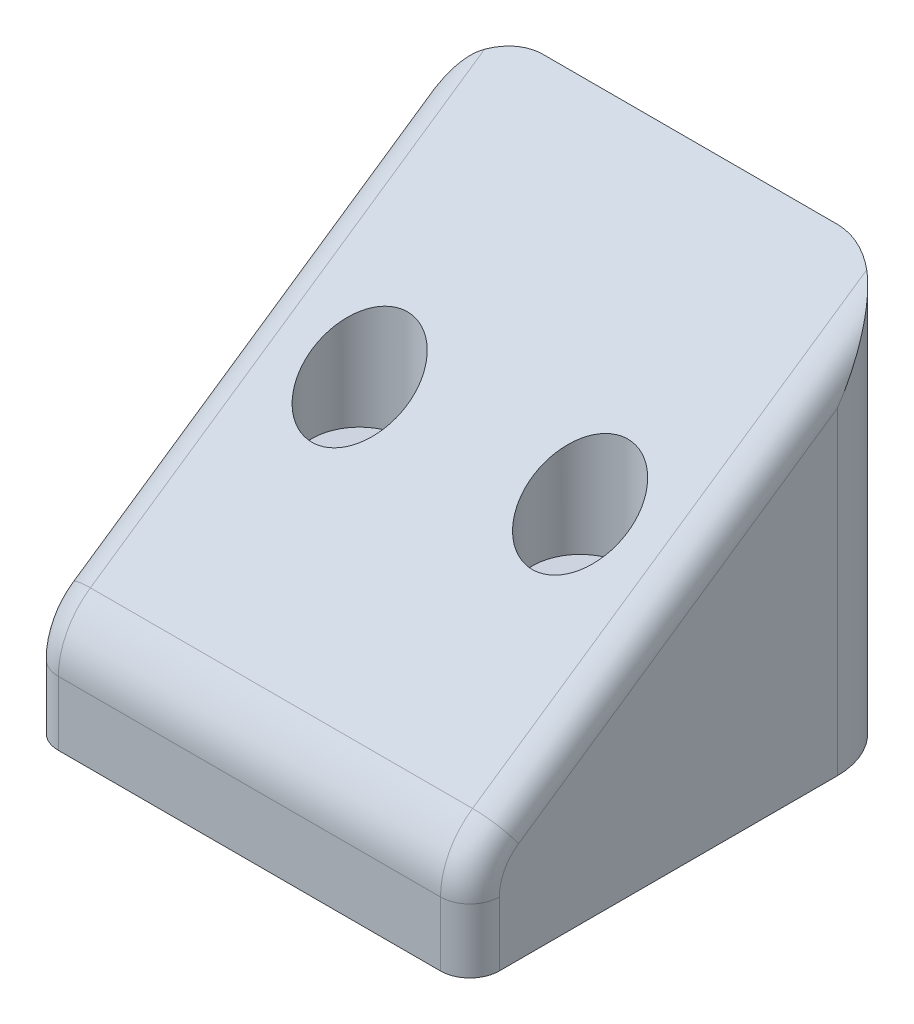
ISO-10303-21;
HEADER;
FILE_DESCRIPTION(('STEP AP214'),'2;1');
FILE_NAME('part.step','',(''),(''),'','','');
FILE_SCHEMA(('AUTOMOTIVE_DESIGN { 1 0 10303 214 1 1 1 1 }'));
ENDSEC;
DATA;
#1=APPLICATION_CONTEXT('core data for automotive mechanical design processes');
#2=APPLICATION_PROTOCOL_DEFINITION('international standard','automotive_design',2000,#1);
#3=PRODUCT_CONTEXT('',#1,'mechanical');
#4=PRODUCT('Part','Part','',(#3));
#5=PRODUCT_RELATED_PRODUCT_CATEGORY('part','',(#4));
#6=PRODUCT_DEFINITION_FORMATION('','',#4);
#7=PRODUCT_DEFINITION_CONTEXT('part definition',#1,'design');
#8=PRODUCT_DEFINITION('design','',#6,#7);
#9=PRODUCT_DEFINITION_SHAPE('','',#8);
#10=(LENGTH_UNIT() NAMED_UNIT(*) SI_UNIT(.MILLI.,.METRE.));
#11=(NAMED_UNIT(*) PLANE_ANGLE_UNIT() SI_UNIT($,.RADIAN.));
#12=(NAMED_UNIT(*) SI_UNIT($,.STERADIAN.) SOLID_ANGLE_UNIT());
#13=UNCERTAINTY_MEASURE_WITH_UNIT(LENGTH_MEASURE(1.E-05),#10,'distance_accuracy_value','');
#14=(GEOMETRIC_REPRESENTATION_CONTEXT(3) GLOBAL_UNCERTAINTY_ASSIGNED_CONTEXT((#13)) GLOBAL_UNIT_ASSIGNED_CONTEXT((#10,
#11,#12)) REPRESENTATION_CONTEXT('',''));
#15=CARTESIAN_POINT('',(0.,0.,0.));
#16=DIRECTION('',(0.,0.,1.));
#17=DIRECTION('',(1.,0.,0.));
#18=AXIS2_PLACEMENT_3D('',#15,#16,#17);
#19=CARTESIAN_POINT('',(-15.,-13.75,30.));
#20=DIRECTION('',(1.,0.,0.));
#21=DIRECTION('',(0.,0.,-1.));
#22=AXIS2_PLACEMENT_3D('',#19,#20,#21);
#23=PLANE('',#22);
#24=DIRECTION('',(0.,0.,-1.));
#25=VECTOR('',#24,1.);
#26=CARTESIAN_POINT('',(-15.,-13.75,30.));
#27=LINE('',#26,#25);
#28=CARTESIAN_POINT('',(-15.,-13.75,28.));
#29=VERTEX_POINT('',#28);
#30=CARTESIAN_POINT('',(-15.,-13.75,5.));
#31=VERTEX_POINT('',#30);
#32=EDGE_CURVE('E267',#29,#31,#27,.T.);
#33=ORIENTED_EDGE('',*,*,#32,.F.);
#34=DIRECTION('',(0.,-1.,0.));
#35=VECTOR('',#34,1.);
#36=CARTESIAN_POINT('',(-15.,-13.75,28.));
#37=LINE('',#36,#35);
#38=CARTESIAN_POINT('',(-15.,-9.38920743300805,28.));
#39=VERTEX_POINT('',#38);
#40=EDGE_CURVE('E175',#29,#39,#37,.F.);
#41=ORIENTED_EDGE('',*,*,#40,.T.);
#42=CARTESIAN_POINT('',(-15.,-9.38920743300805,25.));
#43=DIRECTION('',(1.,0.,0.));
#44=DIRECTION('',(0.,0.,-1.));
#45=AXIS2_PLACEMENT_3D('',#42,#43,#44);
#46=CIRCLE('',#45,3.);
#47=CARTESIAN_POINT('',(-15.,-6.9122735085056,26.6925715150767));
#48=VERTEX_POINT('',#47);
#49=EDGE_CURVE('E173',#39,#48,#46,.F.);
#50=ORIENTED_EDGE('',*,*,#49,.T.);
#51=DIRECTION('',(0.,0.564190505025556,-0.825644641500814));
#52=VECTOR('',#51,1.);
#53=CARTESIAN_POINT('',(-15.,-10.6294657647286,32.1323650607688));
#54=LINE('',#53,#52);
#55=CARTESIAN_POINT('',(-15.,7.91098369346344,5.));
#56=VERTEX_POINT('',#55);
#57=EDGE_CURVE('E171',#48,#56,#54,.T.);
#58=ORIENTED_EDGE('',*,*,#57,.T.);
#59=DIRECTION('',(0.,-1.,0.));
#60=VECTOR('',#59,1.);
#61=CARTESIAN_POINT('',(-15.,-13.75,5.));
#62=LINE('',#61,#60);
#63=EDGE_CURVE('E152',#56,#31,#62,.T.);
#64=ORIENTED_EDGE('',*,*,#63,.T.);
#65=EDGE_LOOP('',(#33,#41,#50,#58,#64));
#66=FACE_BOUND('',#65,.T.);
#67=ADVANCED_FACE('F38',(#66),#23,.F.);
#68=CARTESIAN_POINT('',(-15.,-13.75,30.));
#69=DIRECTION('',(0.,1.,0.));
#70=DIRECTION('',(0.,0.,1.));
#71=AXIS2_PLACEMENT_3D('',#68,#69,#70);
#72=PLANE('',#71);
#73=CARTESIAN_POINT('',(-7.5,-13.75,15.));
#74=DIRECTION('',(0.,1.,0.));
#75=DIRECTION('',(0.,0.,1.));
#76=AXIS2_PLACEMENT_3D('',#73,#74,#75);
#77=CIRCLE('',#76,1.5);
#78=CARTESIAN_POINT('',(-7.5,-13.75,16.5));
#79=VERTEX_POINT('',#78);
#80=EDGE_CURVE('E288',#79,#79,#77,.T.);
#81=ORIENTED_EDGE('',*,*,#80,.T.);
#82=EDGE_LOOP('',(#81));
#83=FACE_BOUND('',#82,.T.);
#84=CARTESIAN_POINT('',(7.5,-13.75,15.));
#85=DIRECTION('',(0.,1.,0.));
#86=DIRECTION('',(0.,0.,-1.));
#87=AXIS2_PLACEMENT_3D('',#84,#85,#86);
#88=CIRCLE('',#87,1.5);
#89=CARTESIAN_POINT('',(7.5,-13.75,13.5));
#90=VERTEX_POINT('',#89);
#91=EDGE_CURVE('E248',#90,#90,#88,.T.);
#92=ORIENTED_EDGE('',*,*,#91,.T.);
#93=EDGE_LOOP('',(#92));
#94=FACE_BOUND('',#93,.T.);
#95=DIRECTION('',(1.,0.,0.));
#96=VECTOR('',#95,1.);
#97=CARTESIAN_POINT('',(-15.,-13.75,30.));
#98=LINE('',#97,#96);
#99=CARTESIAN_POINT('',(-13.,-13.75,30.));
#100=VERTEX_POINT('',#99);
#101=CARTESIAN_POINT('',(13.,-13.75,30.));
#102=VERTEX_POINT('',#101);
#103=EDGE_CURVE('E141',#100,#102,#98,.T.);
#104=ORIENTED_EDGE('',*,*,#103,.F.);
#105=CARTESIAN_POINT('',(-13.,-13.75,28.));
#106=DIRECTION('',(0.,1.,0.));
#107=DIRECTION('',(0.,0.,1.));
#108=AXIS2_PLACEMENT_3D('',#105,#106,#107);
#109=CIRCLE('',#108,2.);
#110=EDGE_CURVE('E169',#100,#29,#109,.F.);
#111=ORIENTED_EDGE('',*,*,#110,.T.);
#112=ORIENTED_EDGE('',*,*,#32,.T.);
#113=CARTESIAN_POINT('',(-10.,-13.75,5.));
#114=DIRECTION('',(0.,1.,0.));
#115=DIRECTION('',(0.,0.,1.));
#116=AXIS2_PLACEMENT_3D('',#113,#114,#115);
#117=CIRCLE('',#116,5.);
#118=CARTESIAN_POINT('',(-10.,-13.75,0.));
#119=VERTEX_POINT('',#118);
#120=EDGE_CURVE('E149',#31,#119,#117,.F.);
#121=ORIENTED_EDGE('',*,*,#120,.T.);
#122=DIRECTION('',(1.,0.,0.));
#123=VECTOR('',#122,1.);
#124=CARTESIAN_POINT('',(-15.,-13.75,0.));
#125=LINE('',#124,#123);
#126=CARTESIAN_POINT('',(10.,-13.75,0.));
#127=VERTEX_POINT('',#126);
#128=EDGE_CURVE('E142',#119,#127,#125,.T.);
#129=ORIENTED_EDGE('',*,*,#128,.T.);
#130=CARTESIAN_POINT('',(10.,-13.75,5.));
#131=DIRECTION('',(0.,1.,0.));
#132=DIRECTION('',(0.,0.,1.));
#133=AXIS2_PLACEMENT_3D('',#130,#131,#132);
#134=CIRCLE('',#133,5.);
#135=CARTESIAN_POINT('',(15.,-13.75,5.));
#136=VERTEX_POINT('',#135);
#137=EDGE_CURVE('E148',#127,#136,#134,.F.);
#138=ORIENTED_EDGE('',*,*,#137,.T.);
#139=DIRECTION('',(0.,0.,-1.));
#140=VECTOR('',#139,1.);
#141=CARTESIAN_POINT('',(15.,-13.75,30.));
#142=LINE('',#141,#140);
#143=CARTESIAN_POINT('',(15.,-13.75,28.));
#144=VERTEX_POINT('',#143);
#145=EDGE_CURVE('E265',#144,#136,#142,.T.);
#146=ORIENTED_EDGE('',*,*,#145,.F.);
#147=CARTESIAN_POINT('',(13.,-13.75,28.));
#148=DIRECTION('',(0.,1.,0.));
#149=DIRECTION('',(0.,0.,1.));
#150=AXIS2_PLACEMENT_3D('',#147,#148,#149);
#151=CIRCLE('',#150,2.);
#152=EDGE_CURVE('E167',#144,#102,#151,.F.);
#153=ORIENTED_EDGE('',*,*,#152,.T.);
#154=EDGE_LOOP('',(#104,#111,#112,#121,#129,#138,#146,#153));
#155=FACE_BOUND('',#154,.T.);
#156=ADVANCED_FACE('F213',(#83,#94,#155),#72,.F.);
#157=CARTESIAN_POINT('',(15.,-13.75,30.));
#158=DIRECTION('',(-1.,0.,0.));
#159=DIRECTION('',(0.,0.,1.));
#160=AXIS2_PLACEMENT_3D('',#157,#158,#159);
#161=PLANE('',#160);
#162=CARTESIAN_POINT('',(15.,-9.38920743300805,25.));
#163=DIRECTION('',(-1.,0.,0.));
#164=DIRECTION('',(0.,0.,1.));
#165=AXIS2_PLACEMENT_3D('',#162,#163,#164);
#166=CIRCLE('',#165,3.);
#167=CARTESIAN_POINT('',(15.,-6.9122735085056,26.6925715150767));
#168=VERTEX_POINT('',#167);
#169=CARTESIAN_POINT('',(15.,-9.38920743300805,28.));
#170=VERTEX_POINT('',#169);
#171=EDGE_CURVE('E177',#168,#170,#166,.F.);
#172=ORIENTED_EDGE('',*,*,#171,.T.);
#173=DIRECTION('',(0.,1.,0.));
#174=VECTOR('',#173,1.);
#175=CARTESIAN_POINT('',(15.,-13.75,28.));
#176=LINE('',#175,#174);
#177=EDGE_CURVE('E181',#170,#144,#176,.F.);
#178=ORIENTED_EDGE('',*,*,#177,.T.);
#179=ORIENTED_EDGE('',*,*,#145,.T.);
#180=DIRECTION('',(0.,1.,0.));
#181=VECTOR('',#180,1.);
#182=CARTESIAN_POINT('',(15.,13.75,5.));
#183=LINE('',#182,#181);
#184=CARTESIAN_POINT('',(15.,7.91098369346344,5.));
#185=VERTEX_POINT('',#184);
#186=EDGE_CURVE('E241',#136,#185,#183,.T.);
#187=ORIENTED_EDGE('',*,*,#186,.T.);
#188=DIRECTION('',(0.,0.564190505025556,-0.825644641500814));
#189=VECTOR('',#188,1.);
#190=CARTESIAN_POINT('',(15.,-10.6294657647286,32.1323650607688));
#191=LINE('',#190,#189);
#192=EDGE_CURVE('E179',#185,#168,#191,.F.);
#193=ORIENTED_EDGE('',*,*,#192,.T.);
#194=EDGE_LOOP('',(#172,#178,#179,#187,#193));
#195=FACE_BOUND('',#194,.T.);
#196=ADVANCED_FACE('F219',(#195),#161,.F.);
#197=CARTESIAN_POINT('',(0.,0.,30.));
#198=DIRECTION('',(0.,0.,-1.));
#199=DIRECTION('',(-1.,0.,0.));
#200=AXIS2_PLACEMENT_3D('',#197,#198,#199);
#201=PLANE('',#200);
#202=DIRECTION('',(1.,0.,0.));
#203=VECTOR('',#202,1.);
#204=CARTESIAN_POINT('',(0.,-9.38920743300805,30.));
#205=LINE('',#204,#203);
#206=CARTESIAN_POINT('',(13.,-9.38920743300805,30.));
#207=VERTEX_POINT('',#206);
#208=CARTESIAN_POINT('',(-13.,-9.38920743300805,30.));
#209=VERTEX_POINT('',#208);
#210=EDGE_CURVE('E260',#207,#209,#205,.F.);
#211=ORIENTED_EDGE('',*,*,#210,.T.);
#212=DIRECTION('',(0.,-1.,0.));
#213=VECTOR('',#212,1.);
#214=CARTESIAN_POINT('',(-13.,0.,30.));
#215=LINE('',#214,#213);
#216=EDGE_CURVE('E165',#209,#100,#215,.T.);
#217=ORIENTED_EDGE('',*,*,#216,.T.);
#218=ORIENTED_EDGE('',*,*,#103,.T.);
#219=DIRECTION('',(0.,1.,0.));
#220=VECTOR('',#219,1.);
#221=CARTESIAN_POINT('',(13.,0.,30.));
#222=LINE('',#221,#220);
#223=EDGE_CURVE('E162',#102,#207,#222,.T.);
#224=ORIENTED_EDGE('',*,*,#223,.T.);
#225=EDGE_LOOP('',(#211,#217,#218,#224));
#226=FACE_BOUND('',#225,.T.);
#227=ADVANCED_FACE('F258',(#226),#201,.F.);
#228=CARTESIAN_POINT('',(0.,0.,0.));
#229=DIRECTION('',(0.,0.,-1.));
#230=DIRECTION('',(-1.,0.,0.));
#231=AXIS2_PLACEMENT_3D('',#228,#229,#230);
#232=PLANE('',#231);
#233=CARTESIAN_POINT('',(4.95,-6.25,0.));
#234=DIRECTION('',(0.,0.,-1.));
#235=DIRECTION('',(-1.,0.,0.));
#236=AXIS2_PLACEMENT_3D('',#233,#234,#235);
#237=CIRCLE('',#236,1.25);
#238=CARTESIAN_POINT('',(3.7,-6.25,0.));
#239=VERTEX_POINT('',#238);
#240=EDGE_CURVE('E283',#239,#239,#237,.T.);
#241=ORIENTED_EDGE('',*,*,#240,.F.);
#242=EDGE_LOOP('',(#241));
#243=FACE_BOUND('',#242,.T.);
#244=CARTESIAN_POINT('',(-4.95,-6.25,0.));
#245=DIRECTION('',(0.,0.,-1.));
#246=DIRECTION('',(-1.,0.,0.));
#247=AXIS2_PLACEMENT_3D('',#244,#245,#246);
#248=CIRCLE('',#247,1.25);
#249=CARTESIAN_POINT('',(-6.2,-6.25,0.));
#250=VERTEX_POINT('',#249);
#251=EDGE_CURVE('E554',#250,#250,#248,.T.);
#252=ORIENTED_EDGE('',*,*,#251,.F.);
#253=EDGE_LOOP('',(#252));
#254=FACE_BOUND('',#253,.T.);
#255=CARTESIAN_POINT('',(-4.95,3.65,0.));
#256=DIRECTION('',(0.,0.,-1.));
#257=DIRECTION('',(-1.,0.,0.));
#258=AXIS2_PLACEMENT_3D('',#255,#256,#257);
#259=CIRCLE('',#258,1.25);
#260=CARTESIAN_POINT('',(-6.2,3.65,0.));
#261=VERTEX_POINT('',#260);
#262=EDGE_CURVE('E543',#261,#261,#259,.T.);
#263=ORIENTED_EDGE('',*,*,#262,.F.);
#264=EDGE_LOOP('',(#263));
#265=FACE_BOUND('',#264,.T.);
#266=CARTESIAN_POINT('',(4.95,3.65,0.));
#267=DIRECTION('',(0.,0.,-1.));
#268=DIRECTION('',(-1.,0.,0.));
#269=AXIS2_PLACEMENT_3D('',#266,#267,#268);
#270=CIRCLE('',#269,1.25);
#271=CARTESIAN_POINT('',(3.7,3.65,0.));
#272=VERTEX_POINT('',#271);
#273=EDGE_CURVE('E271',#272,#272,#270,.T.);
#274=ORIENTED_EDGE('',*,*,#273,.F.);
#275=EDGE_LOOP('',(#274));
#276=FACE_BOUND('',#275,.T.);
#277=DIRECTION('',(-1.,0.,0.));
#278=VECTOR('',#277,1.);
#279=CARTESIAN_POINT('',(-15.,13.75,0.));
#280=LINE('',#279,#278);
#281=CARTESIAN_POINT('',(10.,13.75,0.));
#282=VERTEX_POINT('',#281);
#283=CARTESIAN_POINT('',(-10.,13.75,0.));
#284=VERTEX_POINT('',#283);
#285=EDGE_CURVE('E127',#282,#284,#280,.T.);
#286=ORIENTED_EDGE('',*,*,#285,.F.);
#287=DIRECTION('',(0.,1.,0.));
#288=VECTOR('',#287,1.);
#289=CARTESIAN_POINT('',(10.,-13.75,0.));
#290=LINE('',#289,#288);
#291=EDGE_CURVE('E137',#282,#127,#290,.F.);
#292=ORIENTED_EDGE('',*,*,#291,.T.);
#293=ORIENTED_EDGE('',*,*,#128,.F.);
#294=DIRECTION('',(0.,-1.,0.));
#295=VECTOR('',#294,1.);
#296=CARTESIAN_POINT('',(-10.,13.75,0.));
#297=LINE('',#296,#295);
#298=EDGE_CURVE('E140',#119,#284,#297,.F.);
#299=ORIENTED_EDGE('',*,*,#298,.T.);
#300=EDGE_LOOP('',(#286,#292,#293,#299));
#301=FACE_BOUND('',#300,.T.);
#302=ADVANCED_FACE('F135',(#243,#254,#265,#276,#301),#232,.T.);
#303=CARTESIAN_POINT('',(-15.,13.75,0.));
#304=DIRECTION('',(0.,-0.825644641500814,-0.564190505025556));
#305=DIRECTION('',(0.,0.564190505025556,-0.825644641500814));
#306=AXIS2_PLACEMENT_3D('',#303,#304,#305);
#307=PLANE('',#306);
#308=CARTESIAN_POINT('',(-7.5,3.5,15.));
#309=DIRECTION('',(0.,-0.825644641500814,-0.564190505025556));
#310=DIRECTION('',(0.,0.564190505025556,-0.825644641500814));
#311=AXIS2_PLACEMENT_3D('',#308,#309,#310);
#312=ELLIPSE('',#311,3.93631816478857,3.25);
#313=CARTESIAN_POINT('',(-7.5,5.72083333333333,11.75));
#314=VERTEX_POINT('',#313);
#315=EDGE_CURVE('E279',#314,#314,#312,.T.);
#316=ORIENTED_EDGE('',*,*,#315,.T.);
#317=EDGE_LOOP('',(#316));
#318=FACE_BOUND('',#317,.T.);
#319=CARTESIAN_POINT('',(7.5,3.5,15.));
#320=DIRECTION('',(0.,-0.825644641500814,-0.564190505025556));
#321=DIRECTION('',(0.,0.564190505025556,-0.825644641500814));
#322=AXIS2_PLACEMENT_3D('',#319,#320,#321);
#323=ELLIPSE('',#322,3.93631816478857,3.25);
#324=CARTESIAN_POINT('',(7.5,5.72083333333333,11.75));
#325=VERTEX_POINT('',#324);
#326=EDGE_CURVE('E276',#325,#325,#323,.T.);
#327=ORIENTED_EDGE('',*,*,#326,.T.);
#328=EDGE_LOOP('',(#327));
#329=FACE_BOUND('',#328,.T.);
#330=CARTESIAN_POINT('',(-10.,10.3333333333333,5.));
#331=DIRECTION('',(0.,-0.825644641500814,-0.564190505025556));
#332=DIRECTION('',(0.,0.564190505025556,-0.825644641500814));
#333=AXIS2_PLACEMENT_3D('',#330,#331,#332);
#334=ELLIPSE('',#333,6.05587409967472,5.);
#335=CARTESIAN_POINT('',(-13.,13.0666666666667,1.));
#336=VERTEX_POINT('',#335);
#337=EDGE_CURVE('E132',#284,#336,#334,.F.);
#338=ORIENTED_EDGE('',*,*,#337,.T.);
#339=DIRECTION('',(0.,0.564190505025556,-0.825644641500814));
#340=VECTOR('',#339,1.);
#341=CARTESIAN_POINT('',(-13.,13.75,0.));
#342=LINE('',#341,#340);
#343=CARTESIAN_POINT('',(-13.,-5.26098422550397,27.8209525251278));
#344=VERTEX_POINT('',#343);
#345=EDGE_CURVE('E48',#336,#344,#342,.F.);
#346=ORIENTED_EDGE('',*,*,#345,.T.);
#347=DIRECTION('',(1.,0.,0.));
#348=VECTOR('',#347,1.);
#349=CARTESIAN_POINT('',(-15.,-5.26098422550397,27.8209525251278));
#350=LINE('',#349,#348);
#351=CARTESIAN_POINT('',(13.,-5.26098422550397,27.8209525251278));
#352=VERTEX_POINT('',#351);
#353=EDGE_CURVE('E131',#344,#352,#350,.T.);
#354=ORIENTED_EDGE('',*,*,#353,.T.);
#355=DIRECTION('',(0.,0.564190505025556,-0.825644641500814));
#356=VECTOR('',#355,1.);
#357=CARTESIAN_POINT('',(13.,13.75,0.));
#358=LINE('',#357,#356);
#359=CARTESIAN_POINT('',(13.,13.0666666666667,0.999999999999999));
#360=VERTEX_POINT('',#359);
#361=EDGE_CURVE('E56',#352,#360,#358,.T.);
#362=ORIENTED_EDGE('',*,*,#361,.T.);
#363=CARTESIAN_POINT('',(10.,10.3333333333333,5.));
#364=DIRECTION('',(0.,-0.825644641500814,-0.564190505025556));
#365=DIRECTION('',(0.,-0.564190505025556,0.825644641500814));
#366=AXIS2_PLACEMENT_3D('',#363,#364,#365);
#367=ELLIPSE('',#366,6.05587409967472,5.);
#368=EDGE_CURVE('E124',#360,#282,#367,.F.);
#369=ORIENTED_EDGE('',*,*,#368,.T.);
#370=ORIENTED_EDGE('',*,*,#285,.T.);
#371=EDGE_LOOP('',(#338,#346,#354,#362,#369,#370));
#372=FACE_BOUND('',#371,.T.);
#373=ADVANCED_FACE('F126',(#318,#329,#372),#307,.F.);
#374=CARTESIAN_POINT('',(4.95,3.65,11.));
#375=DIRECTION('',(0.,0.,-1.));
#376=DIRECTION('',(-1.,0.,0.));
#377=AXIS2_PLACEMENT_3D('',#374,#375,#376);
#378=CYLINDRICAL_SURFACE('',#377,1.25);
#379=CARTESIAN_POINT('',(4.95,3.65,11.));
#380=DIRECTION('',(0.,0.,-1.));
#381=DIRECTION('',(-1.,0.,0.));
#382=AXIS2_PLACEMENT_3D('',#379,#380,#381);
#383=CIRCLE('',#382,1.25);
#384=CARTESIAN_POINT('',(3.7,3.65,11.));
#385=VERTEX_POINT('',#384);
#386=EDGE_CURVE('E273',#385,#385,#383,.T.);
#387=ORIENTED_EDGE('',*,*,#386,.F.);
#388=EDGE_LOOP('',(#387));
#389=FACE_BOUND('',#388,.T.);
#390=ORIENTED_EDGE('',*,*,#273,.T.);
#391=EDGE_LOOP('',(#390));
#392=FACE_BOUND('',#391,.T.);
#393=ADVANCED_FACE('F363',(#389,#392),#378,.F.);
#394=CARTESIAN_POINT('',(4.95,3.65,11.));
#395=DIRECTION('',(0.,0.,-1.));
#396=DIRECTION('',(-1.,0.,0.));
#397=AXIS2_PLACEMENT_3D('',#394,#395,#396);
#398=PLANE('',#397);
#399=ORIENTED_EDGE('',*,*,#386,.T.);
#400=EDGE_LOOP('',(#399));
#401=FACE_BOUND('',#400,.T.);
#402=ADVANCED_FACE('F514',(#401),#398,.T.);
#403=CARTESIAN_POINT('',(-4.95,3.65,11.));
#404=DIRECTION('',(0.,0.,-1.));
#405=DIRECTION('',(-1.,0.,0.));
#406=AXIS2_PLACEMENT_3D('',#403,#404,#405);
#407=CYLINDRICAL_SURFACE('',#406,1.25);
#408=CARTESIAN_POINT('',(-4.95,3.65,11.));
#409=DIRECTION('',(0.,0.,-1.));
#410=DIRECTION('',(-1.,0.,0.));
#411=AXIS2_PLACEMENT_3D('',#408,#409,#410);
#412=CIRCLE('',#411,1.25);
#413=CARTESIAN_POINT('',(-6.2,3.65,11.));
#414=VERTEX_POINT('',#413);
#415=EDGE_CURVE('E541',#414,#414,#412,.T.);
#416=ORIENTED_EDGE('',*,*,#415,.F.);
#417=EDGE_LOOP('',(#416));
#418=FACE_BOUND('',#417,.T.);
#419=ORIENTED_EDGE('',*,*,#262,.T.);
#420=EDGE_LOOP('',(#419));
#421=FACE_BOUND('',#420,.T.);
#422=ADVANCED_FACE('F504',(#418,#421),#407,.F.);
#423=CARTESIAN_POINT('',(-4.95,3.65,11.));
#424=DIRECTION('',(0.,0.,-1.));
#425=DIRECTION('',(-1.,0.,0.));
#426=AXIS2_PLACEMENT_3D('',#423,#424,#425);
#427=PLANE('',#426);
#428=ORIENTED_EDGE('',*,*,#415,.T.);
#429=EDGE_LOOP('',(#428));
#430=FACE_BOUND('',#429,.T.);
#431=ADVANCED_FACE('F494',(#430),#427,.T.);
#432=CARTESIAN_POINT('',(-4.95,-6.25,11.));
#433=DIRECTION('',(0.,0.,-1.));
#434=DIRECTION('',(-1.,0.,0.));
#435=AXIS2_PLACEMENT_3D('',#432,#433,#434);
#436=CYLINDRICAL_SURFACE('',#435,1.25);
#437=CARTESIAN_POINT('',(-4.95,-6.25,11.));
#438=DIRECTION('',(0.,0.,-1.));
#439=DIRECTION('',(-1.,0.,0.));
#440=AXIS2_PLACEMENT_3D('',#437,#438,#439);
#441=CIRCLE('',#440,1.25);
#442=CARTESIAN_POINT('',(-6.2,-6.25,11.));
#443=VERTEX_POINT('',#442);
#444=EDGE_CURVE('E547',#443,#443,#441,.T.);
#445=ORIENTED_EDGE('',*,*,#444,.F.);
#446=EDGE_LOOP('',(#445));
#447=FACE_BOUND('',#446,.T.);
#448=ORIENTED_EDGE('',*,*,#251,.T.);
#449=EDGE_LOOP('',(#448));
#450=FACE_BOUND('',#449,.T.);
#451=ADVANCED_FACE('F484',(#447,#450),#436,.F.);
#452=CARTESIAN_POINT('',(-4.95,-6.25,11.));
#453=DIRECTION('',(0.,0.,-1.));
#454=DIRECTION('',(-1.,0.,0.));
#455=AXIS2_PLACEMENT_3D('',#452,#453,#454);
#456=PLANE('',#455);
#457=ORIENTED_EDGE('',*,*,#444,.T.);
#458=EDGE_LOOP('',(#457));
#459=FACE_BOUND('',#458,.T.);
#460=ADVANCED_FACE('F474',(#459),#456,.T.);
#461=CARTESIAN_POINT('',(4.95,-6.25,11.));
#462=DIRECTION('',(0.,0.,-1.));
#463=DIRECTION('',(-1.,0.,0.));
#464=AXIS2_PLACEMENT_3D('',#461,#462,#463);
#465=CYLINDRICAL_SURFACE('',#464,1.25);
#466=CARTESIAN_POINT('',(4.95,-6.25,11.));
#467=DIRECTION('',(0.,0.,-1.));
#468=DIRECTION('',(-1.,0.,0.));
#469=AXIS2_PLACEMENT_3D('',#466,#467,#468);
#470=CIRCLE('',#469,1.25);
#471=CARTESIAN_POINT('',(3.7,-6.25,11.));
#472=VERTEX_POINT('',#471);
#473=EDGE_CURVE('E557',#472,#472,#470,.T.);
#474=ORIENTED_EDGE('',*,*,#473,.F.);
#475=EDGE_LOOP('',(#474));
#476=FACE_BOUND('',#475,.T.);
#477=ORIENTED_EDGE('',*,*,#240,.T.);
#478=EDGE_LOOP('',(#477));
#479=FACE_BOUND('',#478,.T.);
#480=ADVANCED_FACE('F464',(#476,#479),#465,.F.);
#481=CARTESIAN_POINT('',(4.95,-6.25,11.));
#482=DIRECTION('',(0.,0.,-1.));
#483=DIRECTION('',(-1.,0.,0.));
#484=AXIS2_PLACEMENT_3D('',#481,#482,#483);
#485=PLANE('',#484);
#486=ORIENTED_EDGE('',*,*,#473,.T.);
#487=EDGE_LOOP('',(#486));
#488=FACE_BOUND('',#487,.T.);
#489=ADVANCED_FACE('F454',(#488),#485,.T.);
#490=CARTESIAN_POINT('',(7.5,-22.9423881554251,15.));
#491=DIRECTION('',(0.,1.,0.));
#492=DIRECTION('',(0.,0.,1.));
#493=AXIS2_PLACEMENT_3D('',#490,#491,#492);
#494=CYLINDRICAL_SURFACE('',#493,3.25);
#495=CARTESIAN_POINT('',(7.5,-1.75,15.));
#496=DIRECTION('',(0.,1.,0.));
#497=DIRECTION('',(0.,0.,1.));
#498=AXIS2_PLACEMENT_3D('',#495,#496,#497);
#499=CIRCLE('',#498,3.25);
#500=CARTESIAN_POINT('',(7.5,-1.75,18.25));
#501=VERTEX_POINT('',#500);
#502=EDGE_CURVE('E291',#501,#501,#499,.F.);
#503=ORIENTED_EDGE('',*,*,#502,.T.);
#504=EDGE_LOOP('',(#503));
#505=FACE_BOUND('',#504,.T.);
#506=ORIENTED_EDGE('',*,*,#326,.F.);
#507=EDGE_LOOP('',(#506));
#508=FACE_BOUND('',#507,.T.);
#509=ADVANCED_FACE('F437',(#505,#508),#494,.F.);
#510=CARTESIAN_POINT('',(-15.,-1.75,30.));
#511=DIRECTION('',(0.,1.,0.));
#512=DIRECTION('',(0.,0.,1.));
#513=AXIS2_PLACEMENT_3D('',#510,#511,#512);
#514=PLANE('',#513);
#515=CARTESIAN_POINT('',(7.5,-1.75,15.));
#516=DIRECTION('',(0.,1.,0.));
#517=DIRECTION('',(0.,0.,1.));
#518=AXIS2_PLACEMENT_3D('',#515,#516,#517);
#519=CIRCLE('',#518,1.5);
#520=CARTESIAN_POINT('',(7.5,-1.75,16.5));
#521=VERTEX_POINT('',#520);
#522=EDGE_CURVE('E287',#521,#521,#519,.T.);
#523=ORIENTED_EDGE('',*,*,#522,.F.);
#524=EDGE_LOOP('',(#523));
#525=FACE_BOUND('',#524,.T.);
#526=ORIENTED_EDGE('',*,*,#502,.F.);
#527=EDGE_LOOP('',(#526));
#528=FACE_BOUND('',#527,.T.);
#529=ADVANCED_FACE('F432',(#525,#528),#514,.T.);
#530=CARTESIAN_POINT('',(-7.5,-22.9423881554251,15.));
#531=DIRECTION('',(0.,1.,0.));
#532=DIRECTION('',(0.,0.,1.));
#533=AXIS2_PLACEMENT_3D('',#530,#531,#532);
#534=CYLINDRICAL_SURFACE('',#533,3.25);
#535=CARTESIAN_POINT('',(-7.5,-1.75,15.));
#536=DIRECTION('',(0.,1.,0.));
#537=DIRECTION('',(0.,0.,1.));
#538=AXIS2_PLACEMENT_3D('',#535,#536,#537);
#539=CIRCLE('',#538,3.25);
#540=CARTESIAN_POINT('',(-7.5,-1.75,18.25));
#541=VERTEX_POINT('',#540);
#542=EDGE_CURVE('E280',#541,#541,#539,.F.);
#543=ORIENTED_EDGE('',*,*,#542,.T.);
#544=EDGE_LOOP('',(#543));
#545=FACE_BOUND('',#544,.T.);
#546=ORIENTED_EDGE('',*,*,#315,.F.);
#547=EDGE_LOOP('',(#546));
#548=FACE_BOUND('',#547,.T.);
#549=ADVANCED_FACE('F424',(#545,#548),#534,.F.);
#550=CARTESIAN_POINT('',(-15.,-1.75,30.));
#551=DIRECTION('',(0.,1.,0.));
#552=DIRECTION('',(0.,0.,1.));
#553=AXIS2_PLACEMENT_3D('',#550,#551,#552);
#554=PLANE('',#553);
#555=CARTESIAN_POINT('',(-7.5,-1.75,15.));
#556=DIRECTION('',(0.,1.,0.));
#557=DIRECTION('',(0.,0.,1.));
#558=AXIS2_PLACEMENT_3D('',#555,#556,#557);
#559=CIRCLE('',#558,1.5);
#560=CARTESIAN_POINT('',(-7.5,-1.75,16.5));
#561=VERTEX_POINT('',#560);
#562=EDGE_CURVE('E284',#561,#561,#559,.T.);
#563=ORIENTED_EDGE('',*,*,#562,.F.);
#564=EDGE_LOOP('',(#563));
#565=FACE_BOUND('',#564,.T.);
#566=ORIENTED_EDGE('',*,*,#542,.F.);
#567=EDGE_LOOP('',(#566));
#568=FACE_BOUND('',#567,.T.);
#569=ADVANCED_FACE('F414',(#565,#568),#554,.T.);
#570=CARTESIAN_POINT('',(-7.5,-13.75,15.));
#571=DIRECTION('',(0.,1.,0.));
#572=DIRECTION('',(0.,0.,1.));
#573=AXIS2_PLACEMENT_3D('',#570,#571,#572);
#574=CYLINDRICAL_SURFACE('',#573,1.5);
#575=ORIENTED_EDGE('',*,*,#562,.T.);
#576=EDGE_LOOP('',(#575));
#577=FACE_BOUND('',#576,.T.);
#578=ORIENTED_EDGE('',*,*,#80,.F.);
#579=EDGE_LOOP('',(#578));
#580=FACE_BOUND('',#579,.T.);
#581=ADVANCED_FACE('F232',(#577,#580),#574,.F.);
#582=CARTESIAN_POINT('',(7.5,-13.75,15.));
#583=DIRECTION('',(0.,1.,0.));
#584=DIRECTION('',(0.,0.,1.));
#585=AXIS2_PLACEMENT_3D('',#582,#583,#584);
#586=CYLINDRICAL_SURFACE('',#585,1.5);
#587=ORIENTED_EDGE('',*,*,#522,.T.);
#588=EDGE_LOOP('',(#587));
#589=FACE_BOUND('',#588,.T.);
#590=ORIENTED_EDGE('',*,*,#91,.F.);
#591=EDGE_LOOP('',(#590));
#592=FACE_BOUND('',#591,.T.);
#593=ADVANCED_FACE('F226',(#589,#592),#586,.F.);
#594=CARTESIAN_POINT('',(-15.,-9.38920743300805,25.));
#595=DIRECTION('',(1.,0.,0.));
#596=DIRECTION('',(0.,0.,-1.));
#597=AXIS2_PLACEMENT_3D('',#594,#595,#596);
#598=CYLINDRICAL_SURFACE('',#597,5.);
#599=ORIENTED_EDGE('',*,*,#353,.F.);
#600=CARTESIAN_POINT('',(-13.,-9.38920743300805,25.));
#601=DIRECTION('',(1.,0.,0.));
#602=DIRECTION('',(0.,0.,-1.));
#603=AXIS2_PLACEMENT_3D('',#600,#601,#602);
#604=CIRCLE('',#603,5.);
#605=EDGE_CURVE('E159',#344,#209,#604,.T.);
#606=ORIENTED_EDGE('',*,*,#605,.T.);
#607=ORIENTED_EDGE('',*,*,#210,.F.);
#608=CARTESIAN_POINT('',(13.,-9.38920743300805,25.));
#609=DIRECTION('',(-1.,0.,0.));
#610=DIRECTION('',(0.,0.,1.));
#611=AXIS2_PLACEMENT_3D('',#608,#609,#610);
#612=CIRCLE('',#611,5.);
#613=EDGE_CURVE('E157',#207,#352,#612,.T.);
#614=ORIENTED_EDGE('',*,*,#613,.T.);
#615=EDGE_LOOP('',(#599,#606,#607,#614));
#616=FACE_BOUND('',#615,.T.);
#617=ADVANCED_FACE('F224',(#616),#598,.T.);
#618=CARTESIAN_POINT('',(10.,-13.75,5.));
#619=DIRECTION('',(0.,-1.,0.));
#620=DIRECTION('',(0.,0.,-1.));
#621=AXIS2_PLACEMENT_3D('',#618,#619,#620);
#622=CYLINDRICAL_SURFACE('',#621,5.);
#623=ORIENTED_EDGE('',*,*,#368,.F.);
#624=CARTESIAN_POINT('',(13.,13.0666666666667,1.));
#625=CARTESIAN_POINT('',(13.0316987024534,13.0504172387344,1.02377449521724));
#626=CARTESIAN_POINT('',(13.0627775257029,13.0331785416762,1.04767185061226));
#627=CARTESIAN_POINT('',(13.1237150371316,12.9969462696252,1.09565520404544));
#628=CARTESIAN_POINT('',(13.1535743365022,12.9779535896391,1.11974110019661));
#629=CARTESIAN_POINT('',(13.2412359730067,12.9187638260628,1.19209739381254));
#630=CARTESIAN_POINT('',(13.2972987391803,12.8762618076853,1.24059973148116));
#631=CARTESIAN_POINT('',(13.4044490238858,12.7869896039713,1.33736701862517));
#632=CARTESIAN_POINT('',(13.4555866386052,12.7402745442828,1.38562821291399));
#633=CARTESIAN_POINT('',(13.5540170361302,12.6430689385795,1.48236952083501));
#634=CARTESIAN_POINT('',(13.6013063283574,12.5925750429609,1.53084979202726));
#635=CARTESIAN_POINT('',(13.7352815182981,12.4395317584114,1.67367755571937));
#636=CARTESIAN_POINT('',(13.8170592875117,12.3328019045259,1.76816024194274));
#637=CARTESIAN_POINT('',(13.9693269306211,12.1116192585375,1.95711349722791));
#638=CARTESIAN_POINT('',(14.0398102569061,11.9971620409794,2.05158402776468));
#639=CARTESIAN_POINT('',(14.1717039151443,11.7615629490939,2.24131196362951));
#640=CARTESIAN_POINT('',(14.2330171722882,11.6403659695422,2.33656786424862));
#641=CARTESIAN_POINT('',(14.3469399663656,11.3938684238261,2.52686367984676));
#642=CARTESIAN_POINT('',(14.3995511243151,11.2685686271506,2.62190363179192));
#643=CARTESIAN_POINT('',(14.4972502709237,11.014246085375,2.81225305398008));
#644=CARTESIAN_POINT('',(14.5423003359014,10.8852081693848,2.90756157961312));
#645=CARTESIAN_POINT('',(14.6252838589799,10.6247245891145,3.09801730694774));
#646=CARTESIAN_POINT('',(14.663216017694,10.4932784900141,3.19316447605792));
#647=CARTESIAN_POINT('',(14.7325238065471,10.2284634024296,3.38337628494322));
#648=CARTESIAN_POINT('',(14.7638945500045,10.095093059308,3.4784408110681));
#649=CARTESIAN_POINT('',(14.8204549062382,9.82695465232791,3.66844764198155));
#650=CARTESIAN_POINT('',(14.8456438923868,9.69218644821391,3.76338993340998));
#651=CARTESIAN_POINT('',(14.9122532902095,9.28736262098041,4.04734974793886));
#652=CARTESIAN_POINT('',(14.9449793049044,9.01575528800364,4.23623714536109));
#653=CARTESIAN_POINT('',(14.9886668084402,8.47086988273323,4.61368678644811));
#654=CARTESIAN_POINT('',(14.9996436487093,8.19759312554813,4.80224916552851));
#655=CARTESIAN_POINT('',(14.999997145456,7.91991132673155,4.99384023955075));
#656=CARTESIAN_POINT('',(14.999999990835,7.91544750009289,4.99692012651235));
#657=CARTESIAN_POINT('',(15.,7.91098369346345,5.));
#658=B_SPLINE_CURVE_WITH_KNOTS('',3,(#624,#625,#626,#627,#628,#629,#630,#631,#632,#633,#634,
#635,#636,#637,#638,#639,#640,#641,#642,#643,#644,#645,#646,#647,#648,#649,#650,#651,#652,#653,
#654,#655,#656,#657),.UNSPECIFIED.,.F.,.F.,(4,2,2,2,2,2,2,2,2,2,2,2,2,2,2,2,4),(0.,
0.128437998607161,0.25681081737897,0.512838857775628,0.765902049256126,1.01919227817573,
1.51137167065336,2.00383536496417,2.50119063321455,2.99845315015657,3.49813969154926,
3.99791736308424,4.49806593415318,4.99826518299457,5.99478653163229,6.99060424513128,
7.00687394176504),.UNSPECIFIED.);
#659=EDGE_CURVE('E12',#360,#185,#658,.T.);
#660=ORIENTED_EDGE('',*,*,#659,.T.);
#661=ORIENTED_EDGE('',*,*,#186,.F.);
#662=ORIENTED_EDGE('',*,*,#137,.F.);
#663=ORIENTED_EDGE('',*,*,#291,.F.);
#664=EDGE_LOOP('',(#623,#660,#661,#662,#663));
#665=FACE_BOUND('',#664,.T.);
#666=ADVANCED_FACE('F145',(#665),#622,.T.);
#667=CARTESIAN_POINT('',(-10.,-13.75,5.));
#668=DIRECTION('',(0.,1.,0.));
#669=DIRECTION('',(0.,0.,1.));
#670=AXIS2_PLACEMENT_3D('',#667,#668,#669);
#671=CYLINDRICAL_SURFACE('',#670,5.);
#672=ORIENTED_EDGE('',*,*,#63,.F.);
#673=CARTESIAN_POINT('',(-13.,13.0666666666667,1.));
#674=CARTESIAN_POINT('',(-13.0316987024534,13.0504172387344,1.02377449521724));
#675=CARTESIAN_POINT('',(-13.0627775257029,13.0331785416761,1.04767185061226));
#676=CARTESIAN_POINT('',(-13.1237150371317,12.9969462696251,1.09565520404546));
#677=CARTESIAN_POINT('',(-13.1535743365023,12.9779535896391,1.11974110019663));
#678=CARTESIAN_POINT('',(-13.2412359730067,12.9187638260627,1.19209739381257));
#679=CARTESIAN_POINT('',(-13.2972987391803,12.8762618076852,1.2405997314812));
#680=CARTESIAN_POINT('',(-13.4044490238859,12.7869896039713,1.33736701862521));
#681=CARTESIAN_POINT('',(-13.4555866386053,12.7402745442828,1.38562821291402));
#682=CARTESIAN_POINT('',(-13.5540170361302,12.6430689385795,1.48236952083503));
#683=CARTESIAN_POINT('',(-13.6013063283574,12.5925750429609,1.53084979202727));
#684=CARTESIAN_POINT('',(-13.7352815182981,12.4395317584114,1.67367755571936));
#685=CARTESIAN_POINT('',(-13.8170592875116,12.3328019045259,1.76816024194272));
#686=CARTESIAN_POINT('',(-13.9693269306211,12.1116192585376,1.95711349722787));
#687=CARTESIAN_POINT('',(-14.0398102569061,11.9971620409794,2.05158402776462));
#688=CARTESIAN_POINT('',(-14.1717039151443,11.7615629490939,2.24131196362946));
#689=CARTESIAN_POINT('',(-14.2330171722882,11.6403659695422,2.33656786424858));
#690=CARTESIAN_POINT('',(-14.3469399663656,11.3938684238261,2.52686367984674));
#691=CARTESIAN_POINT('',(-14.3995511243151,11.2685686271506,2.62190363179191));
#692=CARTESIAN_POINT('',(-14.4972502709237,11.014246085375,2.81225305398007));
#693=CARTESIAN_POINT('',(-14.5423003359013,10.8852081693848,2.90756157961311));
#694=CARTESIAN_POINT('',(-14.6252838589799,10.6247245891145,3.09801730694774));
#695=CARTESIAN_POINT('',(-14.663216017694,10.4932784900141,3.19316447605793));
#696=CARTESIAN_POINT('',(-14.7325238065471,10.2284634024295,3.38337628494322));
#697=CARTESIAN_POINT('',(-14.7638945500045,10.095093059308,3.47844081106807));
#698=CARTESIAN_POINT('',(-14.8204549062382,9.82695465232789,3.66844764198163));
#699=CARTESIAN_POINT('',(-14.8456438923868,9.69218644821396,3.76338993341018));
#700=CARTESIAN_POINT('',(-14.9122532902095,9.28736262098013,4.0473497479386));
#701=CARTESIAN_POINT('',(-14.9449793049044,9.01575528800242,4.23623714535944));
#702=CARTESIAN_POINT('',(-14.9886668084402,8.47086988273436,4.61368678644983));
#703=CARTESIAN_POINT('',(-14.9996436487093,8.19759312555256,4.80224916553498));
#704=CARTESIAN_POINT('',(-14.999997145456,7.91991132673169,4.99384023955098));
#705=CARTESIAN_POINT('',(-14.999999990835,7.91544750009296,4.99692012651248));
#706=CARTESIAN_POINT('',(-15.,7.91098369346344,5.00000000000002));
#707=B_SPLINE_CURVE_WITH_KNOTS('',3,(#673,#674,#675,#676,#677,#678,#679,#680,#681,#682,#683,
#684,#685,#686,#687,#688,#689,#690,#691,#692,#693,#694,#695,#696,#697,#698,#699,#700,#701,#702,
#703,#704,#705,#706),.UNSPECIFIED.,.F.,.F.,(4,2,2,2,2,2,2,2,2,2,2,2,2,2,2,2,4),(0.,
0.128437998607181,0.256810817379009,0.512838857775707,0.765902049256166,1.01919227817573,
1.5113716706533,2.00383536496406,2.50119063321449,2.99845315015655,3.49813969154925,
3.99791736308424,4.49806593415323,4.99826518299466,5.99478653163235,6.9906042451313,
7.00687394176506),.UNSPECIFIED.);
#708=EDGE_CURVE('E64',#56,#336,#707,.F.);
#709=ORIENTED_EDGE('',*,*,#708,.T.);
#710=ORIENTED_EDGE('',*,*,#337,.F.);
#711=ORIENTED_EDGE('',*,*,#298,.F.);
#712=ORIENTED_EDGE('',*,*,#120,.F.);
#713=EDGE_LOOP('',(#672,#709,#710,#711,#712));
#714=FACE_BOUND('',#713,.T.);
#715=ADVANCED_FACE('F194',(#714),#671,.T.);
#716=CARTESIAN_POINT('',(-13.,-10.6294657647286,32.1323650607688));
#717=DIRECTION('',(0.,0.564190505025556,-0.825644641500814));
#718=DIRECTION('',(0.,0.825644641500814,0.564190505025556));
#719=AXIS2_PLACEMENT_3D('',#716,#717,#718);
#720=CYLINDRICAL_SURFACE('',#719,2.);
#721=ORIENTED_EDGE('',*,*,#708,.F.);
#722=ORIENTED_EDGE('',*,*,#57,.F.);
#723=CARTESIAN_POINT('',(-13.,-6.9122735085056,26.6925715150767));
#724=DIRECTION('',(0.,-0.564190505025557,0.825644641500814));
#725=DIRECTION('',(0.,-0.825644641500814,-0.564190505025557));
#726=AXIS2_PLACEMENT_3D('',#723,#724,#725);
#727=CIRCLE('',#726,2.);
#728=EDGE_CURVE('E246',#344,#48,#727,.T.);
#729=ORIENTED_EDGE('',*,*,#728,.F.);
#730=ORIENTED_EDGE('',*,*,#345,.F.);
#731=EDGE_LOOP('',(#721,#722,#729,#730));
#732=FACE_BOUND('',#731,.T.);
#733=ADVANCED_FACE('F190',(#732),#720,.T.);
#734=CARTESIAN_POINT('',(-13.,0.,28.));
#735=DIRECTION('',(0.,-1.,0.));
#736=DIRECTION('',(0.,0.,-1.));
#737=AXIS2_PLACEMENT_3D('',#734,#735,#736);
#738=CYLINDRICAL_SURFACE('',#737,2.);
#739=ORIENTED_EDGE('',*,*,#110,.F.);
#740=ORIENTED_EDGE('',*,*,#216,.F.);
#741=CARTESIAN_POINT('',(-13.,-9.38920743300805,28.));
#742=DIRECTION('',(0.,1.,0.));
#743=DIRECTION('',(0.,0.,1.));
#744=AXIS2_PLACEMENT_3D('',#741,#742,#743);
#745=CIRCLE('',#744,2.);
#746=EDGE_CURVE('E249',#39,#209,#745,.T.);
#747=ORIENTED_EDGE('',*,*,#746,.F.);
#748=ORIENTED_EDGE('',*,*,#40,.F.);
#749=EDGE_LOOP('',(#739,#740,#747,#748));
#750=FACE_BOUND('',#749,.T.);
#751=ADVANCED_FACE('F203',(#750),#738,.T.);
#752=CARTESIAN_POINT('',(-13.,-9.38920743300805,25.));
#753=DIRECTION('',(1.,0.,0.));
#754=DIRECTION('',(0.,0.,-1.));
#755=AXIS2_PLACEMENT_3D('',#752,#753,#754);
#756=TOROIDAL_SURFACE('',#755,3.,2.);
#757=ORIENTED_EDGE('',*,*,#728,.T.);
#758=ORIENTED_EDGE('',*,*,#49,.F.);
#759=ORIENTED_EDGE('',*,*,#746,.T.);
#760=ORIENTED_EDGE('',*,*,#605,.F.);
#761=EDGE_LOOP('',(#757,#758,#759,#760));
#762=FACE_BOUND('',#761,.T.);
#763=ADVANCED_FACE('F201',(#762),#756,.T.);
#764=CARTESIAN_POINT('',(13.,12.0987107169984,-1.12838101005111));
#765=DIRECTION('',(0.,0.564190505025556,-0.825644641500814));
#766=DIRECTION('',(0.,0.825644641500814,0.564190505025556));
#767=AXIS2_PLACEMENT_3D('',#764,#765,#766);
#768=CYLINDRICAL_SURFACE('',#767,2.);
#769=ORIENTED_EDGE('',*,*,#659,.F.);
#770=ORIENTED_EDGE('',*,*,#361,.F.);
#771=CARTESIAN_POINT('',(13.,-6.9122735085056,26.6925715150767));
#772=DIRECTION('',(0.,-0.564190505025557,0.825644641500814));
#773=DIRECTION('',(0.,-0.825644641500814,-0.564190505025557));
#774=AXIS2_PLACEMENT_3D('',#771,#772,#773);
#775=CIRCLE('',#774,2.);
#776=EDGE_CURVE('E43',#168,#352,#775,.T.);
#777=ORIENTED_EDGE('',*,*,#776,.F.);
#778=ORIENTED_EDGE('',*,*,#192,.F.);
#779=EDGE_LOOP('',(#769,#770,#777,#778));
#780=FACE_BOUND('',#779,.T.);
#781=ADVANCED_FACE('F40',(#780),#768,.T.);
#782=CARTESIAN_POINT('',(13.,-9.38920743300805,25.));
#783=DIRECTION('',(-1.,0.,0.));
#784=DIRECTION('',(0.,0.,1.));
#785=AXIS2_PLACEMENT_3D('',#782,#783,#784);
#786=TOROIDAL_SURFACE('',#785,3.,2.);
#787=ORIENTED_EDGE('',*,*,#776,.T.);
#788=ORIENTED_EDGE('',*,*,#613,.F.);
#789=CARTESIAN_POINT('',(13.,-9.38920743300805,28.));
#790=DIRECTION('',(0.,-1.,0.));
#791=DIRECTION('',(0.,0.,-1.));
#792=AXIS2_PLACEMENT_3D('',#789,#790,#791);
#793=CIRCLE('',#792,2.);
#794=EDGE_CURVE('E299',#170,#207,#793,.T.);
#795=ORIENTED_EDGE('',*,*,#794,.F.);
#796=ORIENTED_EDGE('',*,*,#171,.F.);
#797=EDGE_LOOP('',(#787,#788,#795,#796));
#798=FACE_BOUND('',#797,.T.);
#799=ADVANCED_FACE('F307',(#798),#786,.T.);
#800=CARTESIAN_POINT('',(13.,0.,28.));
#801=DIRECTION('',(0.,1.,0.));
#802=DIRECTION('',(0.,0.,1.));
#803=AXIS2_PLACEMENT_3D('',#800,#801,#802);
#804=CYLINDRICAL_SURFACE('',#803,2.);
#805=ORIENTED_EDGE('',*,*,#152,.F.);
#806=ORIENTED_EDGE('',*,*,#177,.F.);
#807=ORIENTED_EDGE('',*,*,#794,.T.);
#808=ORIENTED_EDGE('',*,*,#223,.F.);
#809=EDGE_LOOP('',(#805,#806,#807,#808));
#810=FACE_BOUND('',#809,.T.);
#811=ADVANCED_FACE('F311',(#810),#804,.T.);
#812=CLOSED_SHELL('',(#67,#156,#196,#227,#302,#373,#393,#402,#422,#431,#451,#460,#480,#489,#509,
#529,#549,#569,#581,#593,#617,#666,#715,#733,#751,#763,#781,#799,#811));
#813=MANIFOLD_SOLID_BREP('B2',#812);
#814=ADVANCED_BREP_SHAPE_REPRESENTATION('',(#18,#813),#14);
#815=SHAPE_DEFINITION_REPRESENTATION(#9,#814);
ENDSEC;
END-ISO-10303-21;
